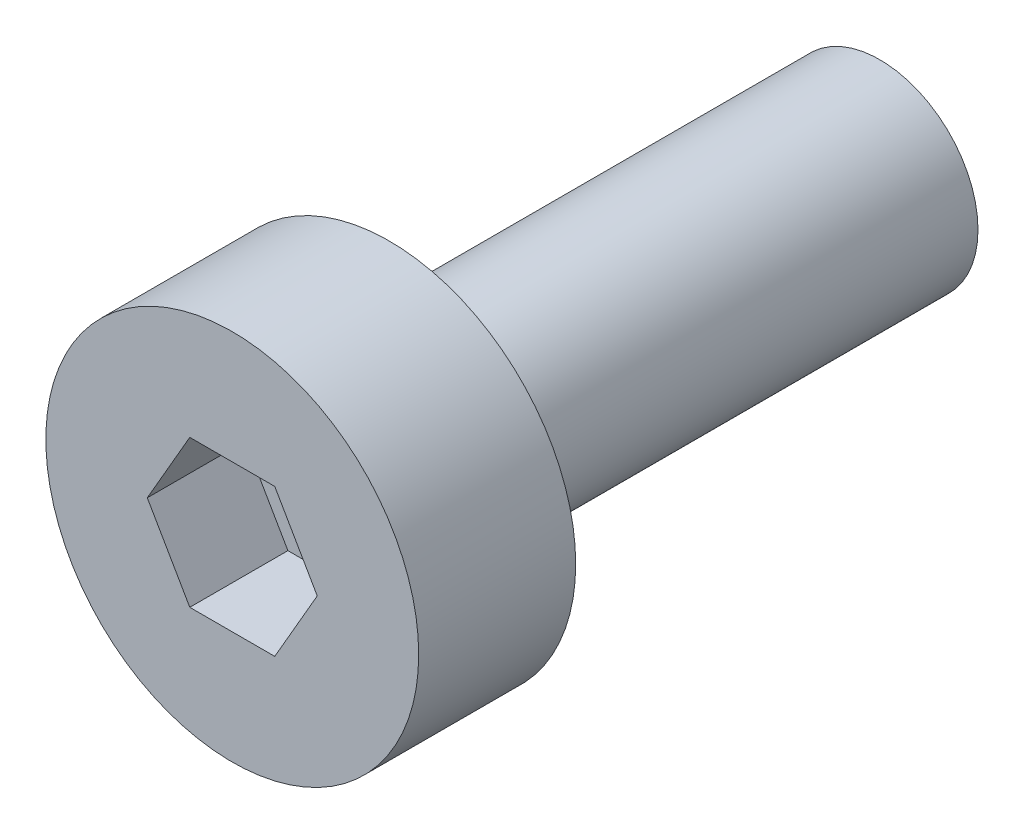
ISO-10303-21;
HEADER;
FILE_DESCRIPTION(('STEP AP214'),'2;1');
FILE_NAME('part.step','',(''),(''),'','','');
FILE_SCHEMA(('AUTOMOTIVE_DESIGN { 1 0 10303 214 1 1 1 1 }'));
ENDSEC;
DATA;
#1=APPLICATION_CONTEXT('core data for automotive mechanical design processes');
#2=APPLICATION_PROTOCOL_DEFINITION('international standard','automotive_design',2000,#1);
#3=PRODUCT_CONTEXT('',#1,'mechanical');
#4=PRODUCT('Part','Part','',(#3));
#5=PRODUCT_RELATED_PRODUCT_CATEGORY('part','',(#4));
#6=PRODUCT_DEFINITION_FORMATION('','',#4);
#7=PRODUCT_DEFINITION_CONTEXT('part definition',#1,'design');
#8=PRODUCT_DEFINITION('design','',#6,#7);
#9=PRODUCT_DEFINITION_SHAPE('','',#8);
#10=(LENGTH_UNIT() NAMED_UNIT(*) SI_UNIT(.MILLI.,.METRE.));
#11=(NAMED_UNIT(*) PLANE_ANGLE_UNIT() SI_UNIT($,.RADIAN.));
#12=(NAMED_UNIT(*) SI_UNIT($,.STERADIAN.) SOLID_ANGLE_UNIT());
#13=UNCERTAINTY_MEASURE_WITH_UNIT(LENGTH_MEASURE(1.E-05),#10,'distance_accuracy_value','');
#14=(GEOMETRIC_REPRESENTATION_CONTEXT(3) GLOBAL_UNCERTAINTY_ASSIGNED_CONTEXT((#13)) GLOBAL_UNIT_ASSIGNED_CONTEXT((#10,
#11,#12)) REPRESENTATION_CONTEXT('',''));
#15=CARTESIAN_POINT('',(0.,0.,0.));
#16=DIRECTION('',(0.,0.,1.));
#17=DIRECTION('',(1.,0.,0.));
#18=AXIS2_PLACEMENT_3D('',#15,#16,#17);
#19=CARTESIAN_POINT('',(0.,0.,5.));
#20=DIRECTION('',(0.,0.,-1.));
#21=DIRECTION('',(-1.,0.,0.));
#22=AXIS2_PLACEMENT_3D('',#19,#20,#21);
#23=CYLINDRICAL_SURFACE('',#22,1.);
#24=CARTESIAN_POINT('',(0.,0.,5.));
#25=DIRECTION('',(0.,0.,1.));
#26=DIRECTION('',(1.,0.,0.));
#27=AXIS2_PLACEMENT_3D('',#24,#25,#26);
#28=CIRCLE('',#27,1.);
#29=CARTESIAN_POINT('',(1.,0.,5.));
#30=VERTEX_POINT('',#29);
#31=EDGE_CURVE('E11',#30,#30,#28,.T.);
#32=ORIENTED_EDGE('',*,*,#31,.F.);
#33=EDGE_LOOP('',(#32));
#34=FACE_BOUND('',#33,.T.);
#35=CARTESIAN_POINT('',(0.,0.,0.));
#36=DIRECTION('',(0.,0.,1.));
#37=DIRECTION('',(1.,0.,0.));
#38=AXIS2_PLACEMENT_3D('',#35,#36,#37);
#39=CIRCLE('',#38,1.);
#40=CARTESIAN_POINT('',(1.,0.,0.));
#41=VERTEX_POINT('',#40);
#42=EDGE_CURVE('E37',#41,#41,#39,.T.);
#43=ORIENTED_EDGE('',*,*,#42,.T.);
#44=EDGE_LOOP('',(#43));
#45=FACE_BOUND('',#44,.T.);
#46=ADVANCED_FACE('F34',(#34,#45),#23,.T.);
#47=CARTESIAN_POINT('',(0.,0.,0.));
#48=DIRECTION('',(0.,0.,1.));
#49=DIRECTION('',(1.,0.,0.));
#50=AXIS2_PLACEMENT_3D('',#47,#48,#49);
#51=PLANE('',#50);
#52=ORIENTED_EDGE('',*,*,#42,.F.);
#53=EDGE_LOOP('',(#52));
#54=FACE_BOUND('',#53,.T.);
#55=ADVANCED_FACE('F165',(#54),#51,.F.);
#56=CARTESIAN_POINT('',(0.,0.,6.6));
#57=DIRECTION('',(0.,0.,-1.));
#58=DIRECTION('',(-1.,0.,0.));
#59=AXIS2_PLACEMENT_3D('',#56,#57,#58);
#60=CYLINDRICAL_SURFACE('',#59,1.9);
#61=CARTESIAN_POINT('',(0.,0.,6.6));
#62=DIRECTION('',(0.,0.,1.));
#63=DIRECTION('',(1.,0.,0.));
#64=AXIS2_PLACEMENT_3D('',#61,#62,#63);
#65=CIRCLE('',#64,1.9);
#66=CARTESIAN_POINT('',(1.9,0.,6.6));
#67=VERTEX_POINT('',#66);
#68=EDGE_CURVE('E141',#67,#67,#65,.T.);
#69=ORIENTED_EDGE('',*,*,#68,.F.);
#70=EDGE_LOOP('',(#69));
#71=FACE_BOUND('',#70,.T.);
#72=CARTESIAN_POINT('',(0.,0.,5.));
#73=DIRECTION('',(0.,0.,1.));
#74=DIRECTION('',(1.,0.,0.));
#75=AXIS2_PLACEMENT_3D('',#72,#73,#74);
#76=CIRCLE('',#75,1.9);
#77=CARTESIAN_POINT('',(1.9,0.,5.));
#78=VERTEX_POINT('',#77);
#79=EDGE_CURVE('E135',#78,#78,#76,.T.);
#80=ORIENTED_EDGE('',*,*,#79,.T.);
#81=EDGE_LOOP('',(#80));
#82=FACE_BOUND('',#81,.T.);
#83=ADVANCED_FACE('F147',(#71,#82),#60,.T.);
#84=CARTESIAN_POINT('',(0.,0.,6.6));
#85=DIRECTION('',(0.,0.,1.));
#86=DIRECTION('',(1.,0.,0.));
#87=AXIS2_PLACEMENT_3D('',#84,#85,#86);
#88=PLANE('',#87);
#89=DIRECTION('',(0.499999999999999,0.866025403784439,0.));
#90=VECTOR('',#89,1.);
#91=CARTESIAN_POINT('',(0.433012701892219,-0.750000000000001,6.6));
#92=LINE('',#91,#90);
#93=CARTESIAN_POINT('',(0.433012701892219,-0.750000000000001,6.6));
#94=VERTEX_POINT('',#93);
#95=CARTESIAN_POINT('',(0.866025403784439,0.,6.6));
#96=VERTEX_POINT('',#95);
#97=EDGE_CURVE('E48',#94,#96,#92,.T.);
#98=ORIENTED_EDGE('',*,*,#97,.F.);
#99=DIRECTION('',(1.,0.,0.));
#100=VECTOR('',#99,1.);
#101=CARTESIAN_POINT('',(-0.43301270189222,-0.750000000000001,6.6));
#102=LINE('',#101,#100);
#103=CARTESIAN_POINT('',(-0.43301270189222,-0.750000000000001,6.6));
#104=VERTEX_POINT('',#103);
#105=EDGE_CURVE('E131',#104,#94,#102,.T.);
#106=ORIENTED_EDGE('',*,*,#105,.F.);
#107=DIRECTION('',(0.5,-0.866025403784439,0.));
#108=VECTOR('',#107,1.);
#109=CARTESIAN_POINT('',(-0.866025403784439,0.,6.6));
#110=LINE('',#109,#108);
#111=CARTESIAN_POINT('',(-0.866025403784439,0.,6.6));
#112=VERTEX_POINT('',#111);
#113=EDGE_CURVE('E129',#112,#104,#110,.T.);
#114=ORIENTED_EDGE('',*,*,#113,.F.);
#115=DIRECTION('',(-0.5,-0.866025403784439,0.));
#116=VECTOR('',#115,1.);
#117=CARTESIAN_POINT('',(-0.43301270189222,0.750000000000001,6.6));
#118=LINE('',#117,#116);
#119=CARTESIAN_POINT('',(-0.43301270189222,0.750000000000001,6.6));
#120=VERTEX_POINT('',#119);
#121=EDGE_CURVE('E96',#120,#112,#118,.T.);
#122=ORIENTED_EDGE('',*,*,#121,.F.);
#123=DIRECTION('',(-1.,0.,0.));
#124=VECTOR('',#123,1.);
#125=CARTESIAN_POINT('',(0.433012701892219,0.750000000000001,6.6));
#126=LINE('',#125,#124);
#127=CARTESIAN_POINT('',(0.433012701892219,0.750000000000001,6.6));
#128=VERTEX_POINT('',#127);
#129=EDGE_CURVE('E125',#128,#120,#126,.T.);
#130=ORIENTED_EDGE('',*,*,#129,.F.);
#131=DIRECTION('',(-0.5,0.866025403784438,0.));
#132=VECTOR('',#131,1.);
#133=CARTESIAN_POINT('',(0.866025403784439,0.,6.6));
#134=LINE('',#133,#132);
#135=EDGE_CURVE('E122',#96,#128,#134,.T.);
#136=ORIENTED_EDGE('',*,*,#135,.F.);
#137=EDGE_LOOP('',(#98,#106,#114,#122,#130,#136));
#138=FACE_BOUND('',#137,.T.);
#139=ORIENTED_EDGE('',*,*,#68,.T.);
#140=EDGE_LOOP('',(#139));
#141=FACE_BOUND('',#140,.T.);
#142=ADVANCED_FACE('F152',(#138,#141),#88,.T.);
#143=CARTESIAN_POINT('',(0.,0.,5.));
#144=DIRECTION('',(0.,0.,1.));
#145=DIRECTION('',(1.,0.,0.));
#146=AXIS2_PLACEMENT_3D('',#143,#144,#145);
#147=PLANE('',#146);
#148=ORIENTED_EDGE('',*,*,#31,.T.);
#149=EDGE_LOOP('',(#148));
#150=FACE_BOUND('',#149,.T.);
#151=ORIENTED_EDGE('',*,*,#79,.F.);
#152=EDGE_LOOP('',(#151));
#153=FACE_BOUND('',#152,.T.);
#154=ADVANCED_FACE('F149',(#150,#153),#147,.F.);
#155=CARTESIAN_POINT('',(0.433012701892219,-0.750000000000001,5.6));
#156=DIRECTION('',(0.866025403784439,-0.5,0.));
#157=DIRECTION('',(0.499999999999999,0.866025403784439,0.));
#158=AXIS2_PLACEMENT_3D('',#155,#156,#157);
#159=PLANE('',#158);
#160=ORIENTED_EDGE('',*,*,#97,.T.);
#161=DIRECTION('',(0.,0.,1.));
#162=VECTOR('',#161,1.);
#163=CARTESIAN_POINT('',(0.866025403784439,0.,5.6));
#164=LINE('',#163,#162);
#165=CARTESIAN_POINT('',(0.866025403784439,0.,5.6));
#166=VERTEX_POINT('',#165);
#167=EDGE_CURVE('E78',#166,#96,#164,.T.);
#168=ORIENTED_EDGE('',*,*,#167,.F.);
#169=DIRECTION('',(0.499999999999999,0.866025403784439,0.));
#170=VECTOR('',#169,1.);
#171=CARTESIAN_POINT('',(0.433012701892219,-0.750000000000001,5.6));
#172=LINE('',#171,#170);
#173=CARTESIAN_POINT('',(0.433012701892219,-0.750000000000001,5.6));
#174=VERTEX_POINT('',#173);
#175=EDGE_CURVE('E133',#174,#166,#172,.T.);
#176=ORIENTED_EDGE('',*,*,#175,.F.);
#177=DIRECTION('',(0.,0.,1.));
#178=VECTOR('',#177,1.);
#179=CARTESIAN_POINT('',(0.433012701892219,-0.750000000000001,5.6));
#180=LINE('',#179,#178);
#181=EDGE_CURVE('E56',#174,#94,#180,.T.);
#182=ORIENTED_EDGE('',*,*,#181,.T.);
#183=EDGE_LOOP('',(#160,#168,#176,#182));
#184=FACE_BOUND('',#183,.T.);
#185=ADVANCED_FACE('F151',(#184),#159,.F.);
#186=CARTESIAN_POINT('',(-0.43301270189222,-0.750000000000001,5.6));
#187=DIRECTION('',(0.,-1.,0.));
#188=DIRECTION('',(1.,0.,0.));
#189=AXIS2_PLACEMENT_3D('',#186,#187,#188);
#190=PLANE('',#189);
#191=ORIENTED_EDGE('',*,*,#105,.T.);
#192=ORIENTED_EDGE('',*,*,#181,.F.);
#193=DIRECTION('',(1.,0.,0.));
#194=VECTOR('',#193,1.);
#195=CARTESIAN_POINT('',(-0.43301270189222,-0.750000000000001,5.6));
#196=LINE('',#195,#194);
#197=CARTESIAN_POINT('',(-0.43301270189222,-0.750000000000001,5.6));
#198=VERTEX_POINT('',#197);
#199=EDGE_CURVE('E108',#198,#174,#196,.T.);
#200=ORIENTED_EDGE('',*,*,#199,.F.);
#201=DIRECTION('',(0.,0.,1.));
#202=VECTOR('',#201,1.);
#203=CARTESIAN_POINT('',(-0.43301270189222,-0.750000000000001,5.6));
#204=LINE('',#203,#202);
#205=EDGE_CURVE('E100',#198,#104,#204,.T.);
#206=ORIENTED_EDGE('',*,*,#205,.T.);
#207=EDGE_LOOP('',(#191,#192,#200,#206));
#208=FACE_BOUND('',#207,.T.);
#209=ADVANCED_FACE('F159',(#208),#190,.F.);
#210=CARTESIAN_POINT('',(-0.866025403784439,0.,5.6));
#211=DIRECTION('',(-0.866025403784439,-0.5,0.));
#212=DIRECTION('',(0.5,-0.866025403784439,0.));
#213=AXIS2_PLACEMENT_3D('',#210,#211,#212);
#214=PLANE('',#213);
#215=ORIENTED_EDGE('',*,*,#113,.T.);
#216=ORIENTED_EDGE('',*,*,#205,.F.);
#217=DIRECTION('',(0.5,-0.866025403784439,0.));
#218=VECTOR('',#217,1.);
#219=CARTESIAN_POINT('',(-0.866025403784439,0.,5.6));
#220=LINE('',#219,#218);
#221=CARTESIAN_POINT('',(-0.866025403784439,0.,5.6));
#222=VERTEX_POINT('',#221);
#223=EDGE_CURVE('E104',#222,#198,#220,.T.);
#224=ORIENTED_EDGE('',*,*,#223,.F.);
#225=DIRECTION('',(0.,0.,1.));
#226=VECTOR('',#225,1.);
#227=CARTESIAN_POINT('',(-0.866025403784439,0.,5.6));
#228=LINE('',#227,#226);
#229=EDGE_CURVE('E89',#222,#112,#228,.T.);
#230=ORIENTED_EDGE('',*,*,#229,.T.);
#231=EDGE_LOOP('',(#215,#216,#224,#230));
#232=FACE_BOUND('',#231,.T.);
#233=ADVANCED_FACE('F105',(#232),#214,.F.);
#234=CARTESIAN_POINT('',(-0.43301270189222,0.750000000000001,5.6));
#235=DIRECTION('',(-0.866025403784439,0.5,0.));
#236=DIRECTION('',(-0.5,-0.866025403784439,0.));
#237=AXIS2_PLACEMENT_3D('',#234,#235,#236);
#238=PLANE('',#237);
#239=ORIENTED_EDGE('',*,*,#121,.T.);
#240=ORIENTED_EDGE('',*,*,#229,.F.);
#241=DIRECTION('',(-0.5,-0.866025403784439,0.));
#242=VECTOR('',#241,1.);
#243=CARTESIAN_POINT('',(-0.43301270189222,0.750000000000001,5.6));
#244=LINE('',#243,#242);
#245=CARTESIAN_POINT('',(-0.43301270189222,0.750000000000001,5.6));
#246=VERTEX_POINT('',#245);
#247=EDGE_CURVE('E93',#246,#222,#244,.T.);
#248=ORIENTED_EDGE('',*,*,#247,.F.);
#249=DIRECTION('',(0.,0.,1.));
#250=VECTOR('',#249,1.);
#251=CARTESIAN_POINT('',(-0.43301270189222,0.750000000000001,5.6));
#252=LINE('',#251,#250);
#253=EDGE_CURVE('E101',#246,#120,#252,.T.);
#254=ORIENTED_EDGE('',*,*,#253,.T.);
#255=EDGE_LOOP('',(#239,#240,#248,#254));
#256=FACE_BOUND('',#255,.T.);
#257=ADVANCED_FACE('F91',(#256),#238,.F.);
#258=CARTESIAN_POINT('',(0.433012701892219,0.750000000000001,5.6));
#259=DIRECTION('',(0.,1.,0.));
#260=DIRECTION('',(0.,0.,1.));
#261=AXIS2_PLACEMENT_3D('',#258,#259,#260);
#262=PLANE('',#261);
#263=ORIENTED_EDGE('',*,*,#129,.T.);
#264=ORIENTED_EDGE('',*,*,#253,.F.);
#265=DIRECTION('',(-1.,0.,0.));
#266=VECTOR('',#265,1.);
#267=CARTESIAN_POINT('',(0.433012701892219,0.750000000000001,5.6));
#268=LINE('',#267,#266);
#269=CARTESIAN_POINT('',(0.433012701892219,0.750000000000001,5.6));
#270=VERTEX_POINT('',#269);
#271=EDGE_CURVE('E114',#270,#246,#268,.T.);
#272=ORIENTED_EDGE('',*,*,#271,.F.);
#273=DIRECTION('',(0.,0.,1.));
#274=VECTOR('',#273,1.);
#275=CARTESIAN_POINT('',(0.433012701892219,0.750000000000001,5.6));
#276=LINE('',#275,#274);
#277=EDGE_CURVE('E138',#270,#128,#276,.T.);
#278=ORIENTED_EDGE('',*,*,#277,.T.);
#279=EDGE_LOOP('',(#263,#264,#272,#278));
#280=FACE_BOUND('',#279,.T.);
#281=ADVANCED_FACE('F220',(#280),#262,.F.);
#282=CARTESIAN_POINT('',(0.866025403784439,0.,5.6));
#283=DIRECTION('',(0.866025403784438,0.5,0.));
#284=DIRECTION('',(-0.5,0.866025403784439,0.));
#285=AXIS2_PLACEMENT_3D('',#282,#283,#284);
#286=PLANE('',#285);
#287=ORIENTED_EDGE('',*,*,#135,.T.);
#288=ORIENTED_EDGE('',*,*,#277,.F.);
#289=DIRECTION('',(-0.5,0.866025403784438,0.));
#290=VECTOR('',#289,1.);
#291=CARTESIAN_POINT('',(0.866025403784439,0.,5.6));
#292=LINE('',#291,#290);
#293=EDGE_CURVE('E116',#166,#270,#292,.T.);
#294=ORIENTED_EDGE('',*,*,#293,.F.);
#295=ORIENTED_EDGE('',*,*,#167,.T.);
#296=EDGE_LOOP('',(#287,#288,#294,#295));
#297=FACE_BOUND('',#296,.T.);
#298=ADVANCED_FACE('F229',(#297),#286,.F.);
#299=CARTESIAN_POINT('',(0.,0.,5.6));
#300=DIRECTION('',(0.,0.,1.));
#301=DIRECTION('',(1.,0.,0.));
#302=AXIS2_PLACEMENT_3D('',#299,#300,#301);
#303=PLANE('',#302);
#304=ORIENTED_EDGE('',*,*,#175,.T.);
#305=ORIENTED_EDGE('',*,*,#293,.T.);
#306=ORIENTED_EDGE('',*,*,#271,.T.);
#307=ORIENTED_EDGE('',*,*,#247,.T.);
#308=ORIENTED_EDGE('',*,*,#223,.T.);
#309=ORIENTED_EDGE('',*,*,#199,.T.);
#310=EDGE_LOOP('',(#304,#305,#306,#307,#308,#309));
#311=FACE_BOUND('',#310,.T.);
#312=ADVANCED_FACE('F111',(#311),#303,.T.);
#313=CLOSED_SHELL('',(#46,#55,#83,#142,#154,#185,#209,#233,#257,#281,#298,#312));
#314=MANIFOLD_SOLID_BREP('B2',#313);
#315=ADVANCED_BREP_SHAPE_REPRESENTATION('',(#18,#314),#14);
#316=SHAPE_DEFINITION_REPRESENTATION(#9,#315);
ENDSEC;
END-ISO-10303-21;
